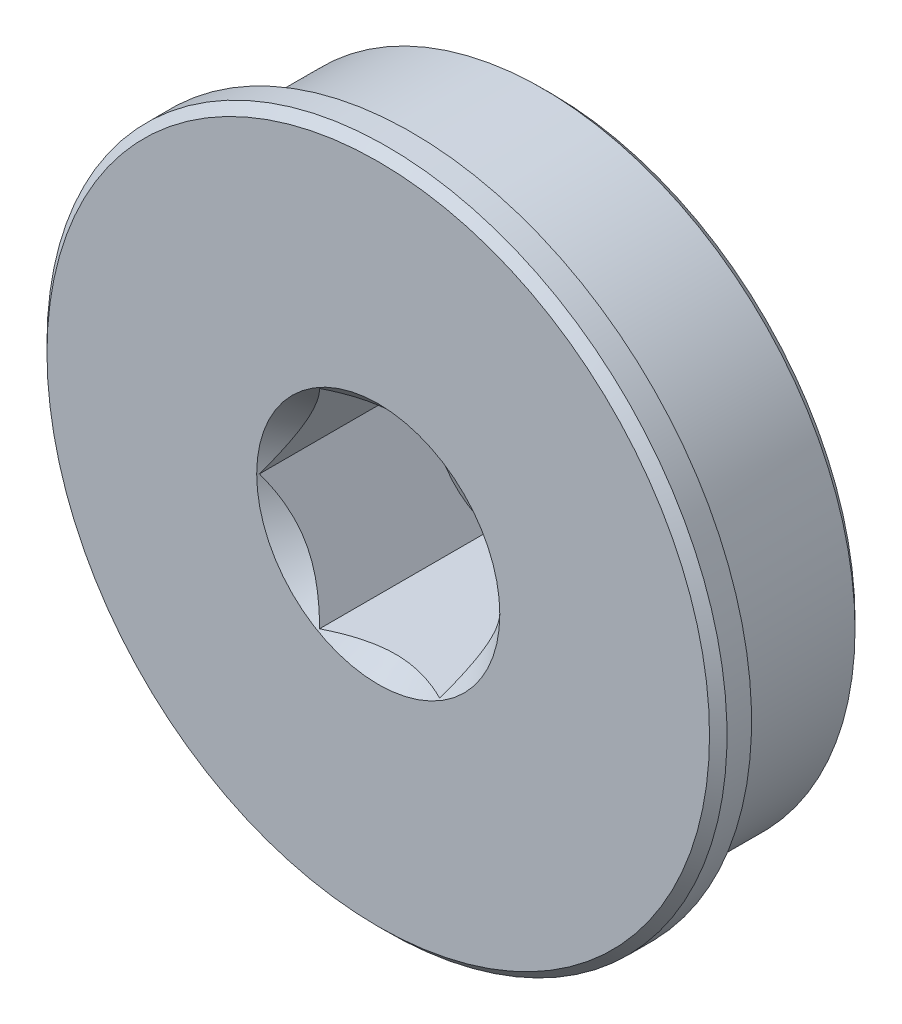
ISO-10303-21;
HEADER;
FILE_DESCRIPTION(('STEP AP214'),'2;1');
FILE_NAME('part.step','',(''),(''),'','','');
FILE_SCHEMA(('AUTOMOTIVE_DESIGN { 1 0 10303 214 1 1 1 1 }'));
ENDSEC;
DATA;
#1=APPLICATION_CONTEXT('core data for automotive mechanical design processes');
#2=APPLICATION_PROTOCOL_DEFINITION('international standard','automotive_design',2000,#1);
#3=PRODUCT_CONTEXT('',#1,'mechanical');
#4=PRODUCT('Part','Part','',(#3));
#5=PRODUCT_RELATED_PRODUCT_CATEGORY('part','',(#4));
#6=PRODUCT_DEFINITION_FORMATION('','',#4);
#7=PRODUCT_DEFINITION_CONTEXT('part definition',#1,'design');
#8=PRODUCT_DEFINITION('design','',#6,#7);
#9=PRODUCT_DEFINITION_SHAPE('','',#8);
#10=(LENGTH_UNIT() NAMED_UNIT(*) SI_UNIT(.MILLI.,.METRE.));
#11=(NAMED_UNIT(*) PLANE_ANGLE_UNIT() SI_UNIT($,.RADIAN.));
#12=(NAMED_UNIT(*) SI_UNIT($,.STERADIAN.) SOLID_ANGLE_UNIT());
#13=UNCERTAINTY_MEASURE_WITH_UNIT(LENGTH_MEASURE(1.E-05),#10,'distance_accuracy_value','');
#14=(GEOMETRIC_REPRESENTATION_CONTEXT(3) GLOBAL_UNCERTAINTY_ASSIGNED_CONTEXT((#13)) GLOBAL_UNIT_ASSIGNED_CONTEXT((#10,
#11,#12)) REPRESENTATION_CONTEXT('',''));
#15=CARTESIAN_POINT('',(0.,0.,0.));
#16=DIRECTION('',(0.,0.,1.));
#17=DIRECTION('',(1.,0.,0.));
#18=AXIS2_PLACEMENT_3D('',#15,#16,#17);
#19=CARTESIAN_POINT('',(0.,0.,7.92734));
#20=DIRECTION('',(0.,0.,-1.));
#21=DIRECTION('',(-1.,0.,0.));
#22=AXIS2_PLACEMENT_3D('',#19,#20,#21);
#23=CYLINDRICAL_SURFACE('',#22,14.2875);
#24=CARTESIAN_POINT('',(0.,0.,5.89534));
#25=DIRECTION('',(0.,0.,-1.));
#26=DIRECTION('',(-1.,0.,0.));
#27=AXIS2_PLACEMENT_3D('',#24,#25,#26);
#28=CIRCLE('',#27,14.2875);
#29=CARTESIAN_POINT('',(-14.2875,0.,5.89534));
#30=VERTEX_POINT('',#29);
#31=EDGE_CURVE('E19',#30,#30,#28,.F.);
#32=ORIENTED_EDGE('',*,*,#31,.F.);
#33=EDGE_LOOP('',(#32));
#34=FACE_BOUND('',#33,.T.);
#35=CARTESIAN_POINT('',(0.,0.,0.399999999999991));
#36=DIRECTION('',(0.,0.,1.));
#37=DIRECTION('',(1.,0.,0.));
#38=AXIS2_PLACEMENT_3D('',#35,#36,#37);
#39=CIRCLE('',#38,14.2875);
#40=CARTESIAN_POINT('',(14.2875,0.,0.39999999999999));
#41=VERTEX_POINT('',#40);
#42=EDGE_CURVE('E111',#41,#41,#39,.F.);
#43=ORIENTED_EDGE('',*,*,#42,.F.);
#44=EDGE_LOOP('',(#43));
#45=FACE_BOUND('',#44,.T.);
#46=ADVANCED_FACE('F16',(#34,#45),#23,.T.);
#47=CARTESIAN_POINT('',(0.,0.,0.399999999999991));
#48=DIRECTION('',(0.,0.,1.));
#49=DIRECTION('',(1.,0.,0.));
#50=AXIS2_PLACEMENT_3D('',#47,#48,#49);
#51=CONICAL_SURFACE('',#50,14.2875,0.785398163397453);
#52=ORIENTED_EDGE('',*,*,#42,.T.);
#53=EDGE_LOOP('',(#52));
#54=FACE_BOUND('',#53,.T.);
#55=CARTESIAN_POINT('',(0.,0.,0.));
#56=DIRECTION('',(0.,0.,1.));
#57=DIRECTION('',(1.,0.,0.));
#58=AXIS2_PLACEMENT_3D('',#55,#56,#57);
#59=CIRCLE('',#58,13.8875);
#60=CARTESIAN_POINT('',(13.8875,0.,0.));
#61=VERTEX_POINT('',#60);
#62=EDGE_CURVE('E107',#61,#61,#59,.F.);
#63=ORIENTED_EDGE('',*,*,#62,.F.);
#64=EDGE_LOOP('',(#63));
#65=FACE_BOUND('',#64,.T.);
#66=ADVANCED_FACE('F324',(#54,#65),#51,.T.);
#67=CARTESIAN_POINT('',(14.2875,0.,5.89534));
#68=DIRECTION('',(0.,0.,1.));
#69=DIRECTION('',(1.,0.,0.));
#70=AXIS2_PLACEMENT_3D('',#67,#68,#69);
#71=PLANE('',#70);
#72=ORIENTED_EDGE('',*,*,#31,.T.);
#73=EDGE_LOOP('',(#72));
#74=FACE_BOUND('',#73,.T.);
#75=CARTESIAN_POINT('',(0.,0.,5.89534));
#76=DIRECTION('',(0.,0.,-1.));
#77=DIRECTION('',(-1.,0.,0.));
#78=AXIS2_PLACEMENT_3D('',#75,#76,#77);
#79=CIRCLE('',#78,13.97);
#80=CARTESIAN_POINT('',(-13.97,0.,5.89534));
#81=VERTEX_POINT('',#80);
#82=EDGE_CURVE('E86',#81,#81,#79,.F.);
#83=ORIENTED_EDGE('',*,*,#82,.F.);
#84=EDGE_LOOP('',(#83));
#85=FACE_BOUND('',#84,.T.);
#86=ADVANCED_FACE('F322',(#74,#85),#71,.T.);
#87=CARTESIAN_POINT('',(0.,0.,0.));
#88=DIRECTION('',(0.,0.,-1.));
#89=DIRECTION('',(-1.,0.,0.));
#90=AXIS2_PLACEMENT_3D('',#87,#88,#89);
#91=PLANE('',#90);
#92=CARTESIAN_POINT('',(0.,0.,0.));
#93=DIRECTION('',(0.,0.,-1.));
#94=DIRECTION('',(-1.,0.,0.));
#95=AXIS2_PLACEMENT_3D('',#92,#93,#94);
#96=CIRCLE('',#95,5.56250000005321);
#97=CARTESIAN_POINT('',(-5.56250000005321,0.,0.));
#98=VERTEX_POINT('',#97);
#99=CARTESIAN_POINT('',(5.56250000005321,0.,0.));
#100=VERTEX_POINT('',#99);
#101=EDGE_CURVE('E80',#98,#100,#96,.F.);
#102=ORIENTED_EDGE('',*,*,#101,.T.);
#103=CARTESIAN_POINT('',(0.,0.,0.));
#104=DIRECTION('',(0.,0.,-1.));
#105=DIRECTION('',(-1.,0.,0.));
#106=AXIS2_PLACEMENT_3D('',#103,#104,#105);
#107=CIRCLE('',#106,5.56250000005321);
#108=EDGE_CURVE('E78',#100,#98,#107,.F.);
#109=ORIENTED_EDGE('',*,*,#108,.T.);
#110=EDGE_LOOP('',(#102,#109));
#111=FACE_BOUND('',#110,.T.);
#112=ORIENTED_EDGE('',*,*,#62,.T.);
#113=EDGE_LOOP('',(#112));
#114=FACE_BOUND('',#113,.T.);
#115=ADVANCED_FACE('F82',(#111,#114),#91,.T.);
#116=CARTESIAN_POINT('',(0.,0.,7.92734));
#117=DIRECTION('',(0.,0.,-1.));
#118=DIRECTION('',(-1.,0.,0.));
#119=AXIS2_PLACEMENT_3D('',#116,#117,#118);
#120=CYLINDRICAL_SURFACE('',#119,13.97);
#121=CARTESIAN_POINT('',(0.,0.,6.40333999999999));
#122=DIRECTION('',(0.,0.,-1.));
#123=DIRECTION('',(-1.,0.,0.));
#124=AXIS2_PLACEMENT_3D('',#121,#122,#123);
#125=CIRCLE('',#124,13.97);
#126=CARTESIAN_POINT('',(-13.97,0.,6.40333999999999));
#127=VERTEX_POINT('',#126);
#128=EDGE_CURVE('E96',#127,#127,#125,.F.);
#129=ORIENTED_EDGE('',*,*,#128,.F.);
#130=EDGE_LOOP('',(#129));
#131=FACE_BOUND('',#130,.T.);
#132=ORIENTED_EDGE('',*,*,#82,.T.);
#133=EDGE_LOOP('',(#132));
#134=FACE_BOUND('',#133,.T.);
#135=ADVANCED_FACE('F317',(#131,#134),#120,.T.);
#136=CARTESIAN_POINT('',(0.,0.,5.6843418860808E-11));
#137=DIRECTION('',(0.,0.,-1.));
#138=DIRECTION('',(-1.,0.,0.));
#139=AXIS2_PLACEMENT_3D('',#136,#137,#138);
#140=CONICAL_SURFACE('',#139,5.56249999999636,0.78539816343273);
#141=DIRECTION('',(-0.707106781186546,0.,0.707106781186549));
#142=VECTOR('',#141,1.);
#143=CARTESIAN_POINT('',(499000.,2.82710390992634E-10,-498994.437500002));
#144=LINE('',#143,#142);
#145=CARTESIAN_POINT('',(5.49926131404698,0.,0.0632386859987952));
#146=VERTEX_POINT('',#145);
#147=EDGE_CURVE('E89',#146,#100,#144,.F.);
#148=ORIENTED_EDGE('',*,*,#147,.T.);
#149=ORIENTED_EDGE('',*,*,#101,.F.);
#150=DIRECTION('',(0.707106781186546,0.,0.707106781186549));
#151=VECTOR('',#150,1.);
#152=CARTESIAN_POINT('',(-499000.,0.,-498994.437500002));
#153=LINE('',#152,#151);
#154=CARTESIAN_POINT('',(-5.49926131403277,0.,0.0632386860104361));
#155=VERTEX_POINT('',#154);
#156=EDGE_CURVE('E97',#98,#155,#153,.T.);
#157=ORIENTED_EDGE('',*,*,#156,.T.);
#158=CARTESIAN_POINT('',(-5.49926131403804,1.18659976195965E-11,0.0632386860107016));
#159=CARTESIAN_POINT('',(-5.45198595772965,-0.0818833190601881,0.110506947567132));
#160=CARTESIAN_POINT('',(-5.4043472336898,-0.164396009504968,0.156324527278759));
#161=CARTESIAN_POINT('',(-5.30827177630542,-0.330803583055125,0.244617067987538));
#162=CARTESIAN_POINT('',(-5.25983462438558,-0.414699191154228,0.287090203603892));
#163=CARTESIAN_POINT('',(-5.11276872494,-0.669424801054789,0.409193172400382));
#164=CARTESIAN_POINT('',(-5.01289507458583,-0.842411037805577,0.482985773947434));
#165=CARTESIAN_POINT('',(-4.81149193757784,-1.19125150390717,0.609350104502553));
#166=CARTESIAN_POINT('',(-4.7100139148593,-1.36701659510731,0.662240148531795));
#167=CARTESIAN_POINT('',(-4.55612875084035,-1.63355351771921,0.72342062198653));
#168=CARTESIAN_POINT('',(-4.50460715798088,-1.72279153423868,0.740780167979902));
#169=CARTESIAN_POINT('',(-4.4011277941172,-1.90202304998548,0.769054944958566));
#170=CARTESIAN_POINT('',(-4.34917008945733,-1.99201643430103,0.779971138755429));
#171=CARTESIAN_POINT('',(-4.22255179984706,-2.21132574507349,0.798274186055481));
#172=CARTESIAN_POINT('',(-4.14775478082757,-2.34087798226995,0.802113970657308));
#173=CARTESIAN_POINT('',(-3.99829560170455,-2.59974887416856,0.795665524085403));
#174=CARTESIAN_POINT('',(-3.92363349805333,-2.72906743109243,0.785372340915283));
#175=CARTESIAN_POINT('',(-3.77501324604949,-2.98648525859677,0.751264702681386));
#176=CARTESIAN_POINT('',(-3.7010559789129,-3.1145830028663,0.727435130186419));
#177=CARTESIAN_POINT('',(-3.55441260790367,-3.36857677204746,0.66755022012039));
#178=CARTESIAN_POINT('',(-3.48172640699253,-3.49447296503472,0.63149582016656));
#179=CARTESIAN_POINT('',(-3.35270421975944,-3.71794594862609,0.557326230398962));
#180=CARTESIAN_POINT('',(-3.29608236647693,-3.81601787533011,0.521162786586692));
#181=CARTESIAN_POINT('',(-3.1838549314029,-4.01040149488146,0.443009120114986));
#182=CARTESIAN_POINT('',(-3.1282493803085,-4.10671313455982,0.40101872178217));
#183=CARTESIAN_POINT('',(-3.01822970362518,-4.29727280440763,0.312152198960926));
#184=CARTESIAN_POINT('',(-2.96381244920262,-4.39152625387591,0.26529144057966));
#185=CARTESIAN_POINT('',(-2.85598543231198,-4.57828812555909,0.16729922706902));
#186=CARTESIAN_POINT('',(-2.80257507665836,-4.67079757520149,0.116170389278389));
#187=CARTESIAN_POINT('',(-2.7496306570061,-4.76250000001645,0.063238686008056));
#188=B_SPLINE_CURVE_WITH_KNOTS('',3,(#158,#159,#160,#161,#162,#163,#164,#165,#166,#167,#168,
#169,#170,#171,#172,#173,#174,#175,#176,#177,#178,#179,#180,#181,#182,#183,#184,#185,#186,#187),
.UNSPECIFIED.,.F.,.F.,(4,2,2,2,2,2,2,2,2,2,2,2,2,2,4),(0.,0.317104656893012,0.634381205252719,
1.27235901342845,1.90020789118233,2.21351671576848,2.52677871165913,2.97501111031568,
3.42340060348885,3.87229184505846,4.32114866544751,4.67761480851316,5.03409170080002,
5.38947620702358,5.74464435760608),.UNSPECIFIED.);
#189=CARTESIAN_POINT('',(-2.74963065702047,-4.76250000000844,0.063238686007807));
#190=VERTEX_POINT('',#189);
#191=EDGE_CURVE('E198',#155,#190,#188,.T.);
#192=ORIENTED_EDGE('',*,*,#191,.T.);
#193=CARTESIAN_POINT('',(-2.74963065703375,-4.76249999999388,0.0632386860051244));
#194=CARTESIAN_POINT('',(-2.6550799444177,-4.76249999999775,0.110506947563377));
#195=CARTESIAN_POINT('',(-2.55980249633826,-4.76249999999939,0.156324527275844));
#196=CARTESIAN_POINT('',(-2.36765158156962,-4.76250000000062,0.244617067985395));
#197=CARTESIAN_POINT('',(-2.27077727772978,-4.76250000000022,0.287090203601681));
#198=CARTESIAN_POINT('',(-1.9766454788383,-4.76249999999957,0.409193172398205));
#199=CARTESIAN_POINT('',(-1.77689817812992,-4.76249999999989,0.482985773945614));
#200=CARTESIAN_POINT('',(-1.37409190411378,-4.76250000000011,0.609350104501253));
#201=CARTESIAN_POINT('',(-1.17113585867659,-4.76250000000002,0.662240148530666));
#202=CARTESIAN_POINT('',(-0.863365530638528,-4.76249999999999,0.723420621985702));
#203=CARTESIAN_POINT('',(-0.760322344919535,-4.7625,0.740780167979182));
#204=CARTESIAN_POINT('',(-0.553363617192058,-4.76250000000001,0.769054944958056));
#205=CARTESIAN_POINT('',(-0.449448207872247,-4.7625,0.77997113875502));
#206=CARTESIAN_POINT('',(-0.196211628651707,-4.7625,0.798274186055298));
#207=CARTESIAN_POINT('',(-0.0466175906127926,-4.7625,0.802113970657263));
#208=CARTESIAN_POINT('',(0.252300767633113,-4.7625,0.795665524085643));
#209=CARTESIAN_POINT('',(0.401624974935481,-4.7625,0.785372340915671));
#210=CARTESIAN_POINT('',(0.69886547894306,-4.7625,0.751264702682073));
#211=CARTESIAN_POINT('',(0.846780013216213,-4.7625,0.727435130187255));
#212=CARTESIAN_POINT('',(1.14006675523461,-4.7625,0.667550220121516));
#213=CARTESIAN_POINT('',(1.28543915705687,-4.7625,0.631495820167828));
#214=CARTESIAN_POINT('',(1.54348353152346,-4.7625,0.557326230400343));
#215=CARTESIAN_POINT('',(1.65672723808892,-4.7625,0.521162786588019));
#216=CARTESIAN_POINT('',(1.88118210823782,-4.7625,0.443009120116156));
#217=CARTESIAN_POINT('',(1.99239321042703,-4.7625,0.401018721783236));
#218=CARTESIAN_POINT('',(2.21243256379448,-4.7625,0.312152198961746));
#219=CARTESIAN_POINT('',(2.32126707264,-4.7625,0.265291440580338));
#220=CARTESIAN_POINT('',(2.53692110642206,-4.7625,0.167299227069382));
#221=CARTESIAN_POINT('',(2.64374181772969,-4.7625,0.116170389278577));
#222=CARTESIAN_POINT('',(2.74963065703459,-4.7625,0.0632386860080572));
#223=B_SPLINE_CURVE_WITH_KNOTS('',3,(#193,#194,#195,#196,#197,#198,#199,#200,#201,#202,#203,
#204,#205,#206,#207,#208,#209,#210,#211,#212,#213,#214,#215,#216,#217,#218,#219,#220,#221,#222),
.UNSPECIFIED.,.F.,.F.,(4,2,2,2,2,2,2,2,2,2,2,2,2,2,4),(0.,0.317104656893387,0.634381205253417,
1.27235901342969,1.90020789118398,2.21351671577036,2.52677871166125,2.9750111103176,
3.42340060349056,3.87229184505998,4.32114866544885,4.67761480851579,5.03409170080393,
5.38947620702875,5.7446443576125),.UNSPECIFIED.);
#224=CARTESIAN_POINT('',(2.74963065702534,-4.7625,0.0632386860126813));
#225=VERTEX_POINT('',#224);
#226=EDGE_CURVE('E241',#190,#225,#223,.T.);
#227=ORIENTED_EDGE('',*,*,#226,.T.);
#228=CARTESIAN_POINT('',(2.74963065700122,-4.76250000001267,0.0632386860051247));
#229=CARTESIAN_POINT('',(2.79690601331258,-4.68061668094318,0.110506947563377));
#230=CARTESIAN_POINT('',(2.84454473735372,-4.59810399049945,0.156324527275843));
#231=CARTESIAN_POINT('',(2.94062019473911,-4.43169641695001,0.244617067985391));
#232=CARTESIAN_POINT('',(2.98905734665868,-4.34780080885058,0.287090203601677));
#233=CARTESIAN_POINT('',(3.13612324610386,-4.09307519894942,0.409193172398199));
#234=CARTESIAN_POINT('',(3.23599689645832,-3.92008896219876,0.482985773945608));
#235=CARTESIAN_POINT('',(3.43740003346658,-3.57124849609714,0.609350104501249));
#236=CARTESIAN_POINT('',(3.5388780561851,-3.39548340489686,0.662240148530663));
#237=CARTESIAN_POINT('',(3.69276322020411,-3.1289464822848,0.723420621985703));
#238=CARTESIAN_POINT('',(3.74428481306361,-3.03970846576528,0.740780167979184));
#239=CARTESIAN_POINT('',(3.84776417692736,-2.86047695001837,0.769054944958059));
#240=CARTESIAN_POINT('',(3.89972188158727,-2.77048356570276,0.779971138755023));
#241=CARTESIAN_POINT('',(4.02634017119754,-2.55117425493029,0.798274186055301));
#242=CARTESIAN_POINT('',(4.10113719021699,-2.4216220177339,0.802113970657266));
#243=CARTESIAN_POINT('',(4.25059636933995,-2.1627511258354,0.795665524085647));
#244=CARTESIAN_POINT('',(4.32525847299113,-2.03343256891158,0.785372340915674));
#245=CARTESIAN_POINT('',(4.47387872499492,-1.77601474140732,0.751264702682075));
#246=CARTESIAN_POINT('',(4.5478359921315,-1.64791699713783,0.727435130187257));
#247=CARTESIAN_POINT('',(4.6944793631407,-1.39392322795673,0.667550220121518));
#248=CARTESIAN_POINT('',(4.76716556405182,-1.26802703496949,0.631495820167831));
#249=CARTESIAN_POINT('',(4.89618775128488,-1.04455405137818,0.557326230400483));
#250=CARTESIAN_POINT('',(4.95280960456738,-0.946482124674183,0.521162786588324));
#251=CARTESIAN_POINT('',(5.06503703964137,-0.752098505122895,0.443009120116835));
#252=CARTESIAN_POINT('',(5.12064259073575,-0.655786865444557,0.401018721784125));
#253=CARTESIAN_POINT('',(5.23066226741904,-0.465227195596805,0.312152198963087));
#254=CARTESIAN_POINT('',(5.28507952184158,-0.370973746128555,0.265291440581923));
#255=CARTESIAN_POINT('',(5.39290653873218,-0.184211874445441,0.167299227071481));
#256=CARTESIAN_POINT('',(5.44631689438579,-0.091702424803064,0.116170389280945));
#257=CARTESIAN_POINT('',(5.49926131403804,1.18695657091106E-11,0.0632386860107053));
#258=B_SPLINE_CURVE_WITH_KNOTS('',3,(#228,#229,#230,#231,#232,#233,#234,#235,#236,#237,#238,
#239,#240,#241,#242,#243,#244,#245,#246,#247,#248,#249,#250,#251,#252,#253,#254,#255,#256,#257),
.UNSPECIFIED.,.F.,.F.,(4,2,2,2,2,2,2,2,2,2,2,2,2,2,4),(0.,0.31710465689338,0.634381205253403,
1.27235901342967,1.90020789118397,2.21351671577036,2.52677871166125,2.97501111031761,
3.42340060349057,3.87229184505999,4.32114866544885,4.67761480851431,5.03409170080096,
5.38947620702431,5.74464435760659),.UNSPECIFIED.);
#259=EDGE_CURVE('E92',#225,#146,#258,.T.);
#260=ORIENTED_EDGE('',*,*,#259,.T.);
#261=EDGE_LOOP('',(#148,#149,#157,#192,#227,#260));
#262=FACE_BOUND('',#261,.T.);
#263=ADVANCED_FACE('F90',(#262),#140,.F.);
#264=CARTESIAN_POINT('',(0.,0.,5.6843418860808E-11));
#265=DIRECTION('',(0.,0.,-1.));
#266=DIRECTION('',(-1.,0.,0.));
#267=AXIS2_PLACEMENT_3D('',#264,#265,#266);
#268=CONICAL_SURFACE('',#267,5.56249999999636,0.785398163397448);
#269=CARTESIAN_POINT('',(5.49926131403893,-1.34103842338314E-11,0.0632386860142758));
#270=CARTESIAN_POINT('',(5.4519859577334,0.0818833190536932,0.110506947571208));
#271=CARTESIAN_POINT('',(5.4043472336964,0.164396009493517,0.156324527283451));
#272=CARTESIAN_POINT('',(5.30827177631776,0.330803583033754,0.244617067993731));
#273=CARTESIAN_POINT('',(5.25983462440078,0.414699191127893,0.287090203610971));
#274=CARTESIAN_POINT('',(5.1127687249638,0.669424801013557,0.409193172410618));
#275=CARTESIAN_POINT('',(5.01289507461536,0.842411037754417,0.482985773960409));
#276=CARTESIAN_POINT('',(4.81149193761852,1.1912515038367,0.609350104522551));
#277=CARTESIAN_POINT('',(4.7100139149054,1.36701659502745,0.662240148556033));
#278=CARTESIAN_POINT('',(4.55612875089437,1.63355351762563,0.723420622018186));
#279=CARTESIAN_POINT('',(4.5046071580375,1.7227915341406,0.740780168014203));
#280=CARTESIAN_POINT('',(4.40112779417895,1.90202304987853,0.769054944998465));
#281=CARTESIAN_POINT('',(4.34917008952159,1.99201643418973,0.77997113879828));
#282=CARTESIAN_POINT('',(4.22255179992084,2.2113257449457,0.798274186105289));
#283=CARTESIAN_POINT('',(4.14775478090832,2.34087798213007,0.802113970711906));
#284=CARTESIAN_POINT('',(3.998295601799,2.59974887400496,0.795665524151122));
#285=CARTESIAN_POINT('',(3.9236334981545,2.72906743091721,0.785372340987336));
#286=CARTESIAN_POINT('',(3.77501324616378,2.98648525839881,0.751264702767226));
#287=CARTESIAN_POINT('',(3.7010559790336,3.11458300265724,0.727435130279712));
#288=CARTESIAN_POINT('',(3.55441260803689,3.3685767718167,0.667550220229242));
#289=CARTESIAN_POINT('',(3.48172640713187,3.49447296479336,0.631495820283519));
#290=CARTESIAN_POINT('',(3.35270421989156,3.71794594839724,0.557326230520373));
#291=CARTESIAN_POINT('',(3.29608236659605,3.81601787512378,0.521162786702295));
#292=CARTESIAN_POINT('',(3.18385493149657,4.01040149471922,0.443009120215609));
#293=CARTESIAN_POINT('',(3.12824938038971,4.10671313441917,0.401018721873618));
#294=CARTESIAN_POINT('',(3.01822970368199,4.29727280430924,0.312152199031279));
#295=CARTESIAN_POINT('',(2.96381244924748,4.3915262537982,0.265291440638092));
#296=CARTESIAN_POINT('',(2.85598543233356,4.57828812552171,0.167299227101493));
#297=CARTESIAN_POINT('',(2.80257507666858,4.67079757518378,0.116170389296827));
#298=CARTESIAN_POINT('',(2.74963065700522,4.76250000001796,0.0632386860116488));
#299=B_SPLINE_CURVE_WITH_KNOTS('',3,(#269,#270,#271,#272,#273,#274,#275,#276,#277,#278,#279,
#280,#281,#282,#283,#284,#285,#286,#287,#288,#289,#290,#291,#292,#293,#294,#295,#296,#297,#298),
.UNSPECIFIED.,.F.,.F.,(4,2,2,2,2,2,2,2,2,2,2,2,2,2,4),(0.,0.317104656878347,0.634381205223374,
1.27235901336977,1.90020789109549,2.21351671566756,2.52677871154414,2.97501111015932,
3.42340060329106,3.87229184481917,4.32114866516673,4.6776148083118,5.0340917006782,
5.38947620698162,5.74464435764363),.UNSPECIFIED.);
#300=CARTESIAN_POINT('',(2.74963065701027,4.76250000000922,0.0632386860166967));
#301=VERTEX_POINT('',#300);
#302=EDGE_CURVE('E182',#146,#301,#299,.T.);
#303=ORIENTED_EDGE('',*,*,#302,.T.);
#304=CARTESIAN_POINT('',(2.74963065703541,4.76249999999333,0.0632386860084486));
#305=CARTESIAN_POINT('',(2.65507994442516,4.76249999999754,0.110506947567354));
#306=CARTESIAN_POINT('',(2.55980249635148,4.76249999999933,0.1563245272805));
#307=CARTESIAN_POINT('',(2.36765158159434,4.76250000000068,0.244617067991594));
#308=CARTESIAN_POINT('',(2.27077727776023,4.76250000000024,0.287090203608747));
#309=CARTESIAN_POINT('',(1.97664547888597,4.76249999999953,0.40919317240839));
#310=CARTESIAN_POINT('',(1.77689817818909,4.76249999999988,0.482985773958544));
#311=CARTESIAN_POINT('',(1.37409190419531,4.76250000000013,0.609350104521207));
#312=CARTESIAN_POINT('',(1.17113585876899,4.76250000000003,0.662240148554853));
#313=CARTESIAN_POINT('',(0.863365530746804,4.76249999999999,0.723420622017311));
#314=CARTESIAN_POINT('',(0.760322345033031,4.7625,0.74078016801344));
#315=CARTESIAN_POINT('',(0.553363617315818,4.76250000000001,0.769054944997919));
#316=CARTESIAN_POINT('',(0.449448208001051,4.76250000000001,0.779971138797839));
#317=CARTESIAN_POINT('',(0.196211628799575,4.7625,0.798274186105088));
#318=CARTESIAN_POINT('',(0.0466175907746237,4.76250000000001,0.802113970711852));
#319=CARTESIAN_POINT('',(-0.252300767443882,4.76250000000001,0.795665524151375));
#320=CARTESIAN_POINT('',(-0.401624974732814,4.76250000000001,0.785372340987749));
#321=CARTESIAN_POINT('',(-0.698865478714131,4.76250000000001,0.751264702767959));
#322=CARTESIAN_POINT('',(-0.84678001297446,4.76250000000001,0.727435130280605));
#323=CARTESIAN_POINT('',(-1.14006675496779,4.76250000000001,0.667550220230448));
#324=CARTESIAN_POINT('',(-1.2854391567778,4.76250000000001,0.631495820284878));
#325=CARTESIAN_POINT('',(-1.54348353125888,4.76250000000001,0.557326230521854));
#326=CARTESIAN_POINT('',(-1.65672723785036,4.76250000000001,0.521162786703718));
#327=CARTESIAN_POINT('',(-1.88118210805024,4.76250000000001,0.443009120216864));
#328=CARTESIAN_POINT('',(-1.99239321026441,4.76250000000001,0.401018721874762));
#329=CARTESIAN_POINT('',(-2.21243256368073,4.76250000000001,0.312152199032158));
#330=CARTESIAN_POINT('',(-2.32126707255016,4.76250000000001,0.265291440638818));
#331=CARTESIAN_POINT('',(-2.53692110637885,4.76250000000001,0.167299227101879));
#332=CARTESIAN_POINT('',(-2.64374181770921,4.76250000000001,0.116170389297026));
#333=CARTESIAN_POINT('',(-2.74963065703633,4.76250000000001,0.0632386860116463));
#334=B_SPLINE_CURVE_WITH_KNOTS('',3,(#304,#305,#306,#307,#308,#309,#310,#311,#312,#313,#314,
#315,#316,#317,#318,#319,#320,#321,#322,#323,#324,#325,#326,#327,#328,#329,#330,#331,#332,#333),
.UNSPECIFIED.,.F.,.F.,(4,2,2,2,2,2,2,2,2,2,2,2,2,2,4),(0.,0.317104656878694,0.634381205224013,
1.27235901337088,1.90020789109692,2.21351671566918,2.52677871154595,2.97501111016091,
3.42340060329241,3.87229184482032,4.32114866516769,4.67761480831413,5.03409170068191,
5.38947620698669,5.74464435765004),.UNSPECIFIED.);
#335=CARTESIAN_POINT('',(-2.74963065702623,4.76250000000001,0.0632386860166947));
#336=VERTEX_POINT('',#335);
#337=EDGE_CURVE('E192',#301,#336,#334,.T.);
#338=ORIENTED_EDGE('',*,*,#337,.T.);
#339=CARTESIAN_POINT('',(-2.7496306569999,4.76250000001383,0.063238686008446));
#340=CARTESIAN_POINT('',(-2.79690601330868,4.68061668094954,0.110506947567351));
#341=CARTESIAN_POINT('',(-2.84454473734706,4.59810399051088,0.156324527280496));
#342=CARTESIAN_POINT('',(-2.9406201947268,4.43169641697145,0.244617067991589));
#343=CARTESIAN_POINT('',(-2.98905734664347,4.34780080887696,0.28709020360874));
#344=CARTESIAN_POINT('',(-3.13612324607998,4.0930751989907,0.409193172408382));
#345=CARTESIAN_POINT('',(-3.23599689642873,3.92008896225,0.482985773958535));
#346=CARTESIAN_POINT('',(-3.43740003342583,3.57124849616776,0.609350104521201));
#347=CARTESIAN_POINT('',(-3.5388780561389,3.39548340497688,0.66224014855485));
#348=CARTESIAN_POINT('',(-3.69276322014997,3.12894648237858,0.723420622017311));
#349=CARTESIAN_POINT('',(-3.74428481300687,3.03970846586357,0.74078016801344));
#350=CARTESIAN_POINT('',(-3.84776417686548,2.86047695012556,0.76905494499792));
#351=CARTESIAN_POINT('',(-3.89972188152286,2.77048356581431,0.77997113879784));
#352=CARTESIAN_POINT('',(-4.0263401711236,2.55117425505836,0.798274186105089));
#353=CARTESIAN_POINT('',(-4.10113719013608,2.42162201787405,0.802113970711854));
#354=CARTESIAN_POINT('',(-4.25059636924534,2.16275112599929,0.795665524151377));
#355=CARTESIAN_POINT('',(-4.3252584728898,2.0334325690871,0.78537234098775));
#356=CARTESIAN_POINT('',(-4.47387872488046,1.77601474160559,0.75126470276796));
#357=CARTESIAN_POINT('',(-4.54783599201062,1.6479169973472,0.727435130280605));
#358=CARTESIAN_POINT('',(-4.69447936300729,1.39392322818781,0.667550220230449));
#359=CARTESIAN_POINT('',(-4.76716556391229,1.26802703521118,0.63149582028488));
#360=CARTESIAN_POINT('',(-4.89618775115259,1.04455405160731,0.557326230521992));
#361=CARTESIAN_POINT('',(-4.95280960444811,0.946482124880775,0.52116278670402));
#362=CARTESIAN_POINT('',(-5.06503703954759,0.752098505285329,0.443009120217536));
#363=CARTESIAN_POINT('',(-5.12064259065445,0.655786865585378,0.401018721875641));
#364=CARTESIAN_POINT('',(-5.23066226736217,0.465227195695301,0.312152199033486));
#365=CARTESIAN_POINT('',(-5.28507952179667,0.370973746206341,0.265291440640388));
#366=CARTESIAN_POINT('',(-5.3929065387106,0.184211874482832,0.167299227103959));
#367=CARTESIAN_POINT('',(-5.44631689437558,0.0917024248207689,0.116170389299374));
#368=CARTESIAN_POINT('',(-5.49926131403893,-1.34137727442273E-11,0.0632386860142718));
#369=B_SPLINE_CURVE_WITH_KNOTS('',3,(#339,#340,#341,#342,#343,#344,#345,#346,#347,#348,#349,
#350,#351,#352,#353,#354,#355,#356,#357,#358,#359,#360,#361,#362,#363,#364,#365,#366,#367,#368),
.UNSPECIFIED.,.F.,.F.,(4,2,2,2,2,2,2,2,2,2,2,2,2,2,4),(0.,0.317104656878688,0.634381205224,
1.27235901337085,1.90020789109691,2.21351671566918,2.52677871154596,2.97501111016092,
3.42340060329243,3.87229184482033,4.32114866516769,4.67761480831267,5.03409170067897,
5.38947620698229,5.74464435764419),.UNSPECIFIED.);
#370=EDGE_CURVE('E214',#336,#155,#369,.T.);
#371=ORIENTED_EDGE('',*,*,#370,.T.);
#372=ORIENTED_EDGE('',*,*,#156,.F.);
#373=ORIENTED_EDGE('',*,*,#108,.F.);
#374=ORIENTED_EDGE('',*,*,#147,.F.);
#375=EDGE_LOOP('',(#303,#338,#371,#372,#373,#374));
#376=FACE_BOUND('',#375,.T.);
#377=ADVANCED_FACE('F99',(#376),#268,.F.);
#378=CARTESIAN_POINT('',(13.97,0.,6.40334));
#379=DIRECTION('',(0.,0.,-1.));
#380=DIRECTION('',(-1.,0.,0.));
#381=AXIS2_PLACEMENT_3D('',#378,#379,#380);
#382=PLANE('',#381);
#383=ORIENTED_EDGE('',*,*,#128,.T.);
#384=EDGE_LOOP('',(#383));
#385=FACE_BOUND('',#384,.T.);
#386=CARTESIAN_POINT('',(0.,0.,6.40334));
#387=DIRECTION('',(0.,0.,-1.));
#388=DIRECTION('',(-1.,0.,0.));
#389=AXIS2_PLACEMENT_3D('',#386,#387,#388);
#390=CIRCLE('',#389,15.5575);
#391=CARTESIAN_POINT('',(-15.5575,0.,6.40334));
#392=VERTEX_POINT('',#391);
#393=EDGE_CURVE('E220',#392,#392,#390,.F.);
#394=ORIENTED_EDGE('',*,*,#393,.F.);
#395=EDGE_LOOP('',(#394));
#396=FACE_BOUND('',#395,.T.);
#397=ADVANCED_FACE('F208',(#385,#396),#382,.T.);
#398=CARTESIAN_POINT('',(-2.7496306570156,-4.7625,-2.07266));
#399=DIRECTION('',(0.,-1.,0.));
#400=DIRECTION('',(1.,0.,0.));
#401=AXIS2_PLACEMENT_3D('',#398,#399,#400);
#402=PLANE('',#401);
#403=DIRECTION('',(0.,0.,1.));
#404=VECTOR('',#403,1.);
#405=CARTESIAN_POINT('',(-2.74963065701559,-4.7625,-2.07266));
#406=LINE('',#405,#404);
#407=CARTESIAN_POINT('',(-2.74963065347593,-4.76250000613089,7.86410131755513));
#408=VERTEX_POINT('',#407);
#409=EDGE_CURVE('E251',#190,#408,#406,.T.);
#410=ORIENTED_EDGE('',*,*,#409,.T.);
#411=CARTESIAN_POINT('',(-2.74963058630131,-4.7625,7.86410127865832));
#412=CARTESIAN_POINT('',(-2.65507987582223,-4.7625,7.81683301907868));
#413=CARTESIAN_POINT('',(-2.55980242990703,-4.7625,7.77101544131861));
#414=CARTESIAN_POINT('',(-2.36765151953662,-4.7625,7.6827229044405));
#415=CARTESIAN_POINT('',(-2.27077721793085,-4.7625,7.64024977070313));
#416=CARTESIAN_POINT('',(-1.97664542596643,-4.7625,7.51814680744944));
#417=CARTESIAN_POINT('',(-1.77689813007265,-4.7625,7.44435420940901));
#418=CARTESIAN_POINT('',(-1.37409186581547,-4.7625,7.31798988502014));
#419=CARTESIAN_POINT('',(-1.17113582531008,-4.7625,7.26509984368129));
#420=CARTESIAN_POINT('',(-0.863365504906673,-4.7625,7.20391937345893));
#421=CARTESIAN_POINT('',(-0.760322321760773,-4.7625,7.18655982840794));
#422=CARTESIAN_POINT('',(-0.553363599247437,-4.7625,7.15828505300743));
#423=CARTESIAN_POINT('',(-0.449448192568649,-4.7625,7.1473688598465));
#424=CARTESIAN_POINT('',(-0.196211616210636,-4.7625,7.12906581341892));
#425=CARTESIAN_POINT('',(-0.0466175783897936,-4.7625,7.12522602921167));
#426=CARTESIAN_POINT('',(0.252300779382325,-4.7625,7.13167447652517));
#427=CARTESIAN_POINT('',(0.401624986428969,-4.7625,7.14196766004211));
#428=CARTESIAN_POINT('',(0.698865489885795,-4.7625,7.17607529890175));
#429=CARTESIAN_POINT('',(0.846780023864053,-4.7625,7.19990487167419));
#430=CARTESIAN_POINT('',(1.14006676528345,-4.7625,7.25978978221977));
#431=CARTESIAN_POINT('',(1.28543916680162,-4.7625,7.29584418237563));
#432=CARTESIAN_POINT('',(1.54348353378876,-4.7625,7.37001377044799));
#433=CARTESIAN_POINT('',(1.65672723329773,-4.7625,7.40617721197187));
#434=CARTESIAN_POINT('',(1.88118208958368,-4.7625,7.48433087316742));
#435=CARTESIAN_POINT('',(1.9923931849666,-4.7625,7.52632126851205));
#436=CARTESIAN_POINT('',(2.21243252498062,-4.7625,7.61518778481037));
#437=CARTESIAN_POINT('',(2.32126702727848,-4.7625,7.66204853965798));
#438=CARTESIAN_POINT('',(2.53692104821533,-4.7625,7.7600407456796));
#439=CARTESIAN_POINT('',(2.64374175322498,-4.7625,7.81116957951583));
#440=CARTESIAN_POINT('',(2.74963058633439,-4.7625,7.86410127867486));
#441=B_SPLINE_CURVE_WITH_KNOTS('',3,(#411,#412,#413,#414,#415,#416,#417,#418,#419,#420,#421,
#422,#423,#424,#425,#426,#427,#428,#429,#430,#431,#432,#433,#434,#435,#436,#437,#438,#439,#440),
.UNSPECIFIED.,.F.,.F.,(4,2,2,2,2,2,2,2,2,2,2,2,2,2,4),(0.,0.317104648505196,0.634381188464759,
1.27235897947922,1.90020784095936,2.21351665747616,2.52677864530375,2.97501104327637,
3.42340053576013,3.87229177659448,4.32114859624607,4.67761471709309,5.03409158713586,
5.38947607114111,5.74464419957785),.UNSPECIFIED.);
#442=CARTESIAN_POINT('',(2.74963062167499,-4.7625,7.86410129634516));
#443=VERTEX_POINT('',#442);
#444=EDGE_CURVE('E224',#408,#443,#441,.T.);
#445=ORIENTED_EDGE('',*,*,#444,.T.);
#446=DIRECTION('',(0.,0.,1.));
#447=VECTOR('',#446,1.);
#448=CARTESIAN_POINT('',(2.74963065701559,-4.7625,-2.07266));
#449=LINE('',#448,#447);
#450=EDGE_CURVE('E246',#443,#225,#449,.F.);
#451=ORIENTED_EDGE('',*,*,#450,.T.);
#452=ORIENTED_EDGE('',*,*,#226,.F.);
#453=EDGE_LOOP('',(#410,#445,#451,#452));
#454=FACE_BOUND('',#453,.T.);
#455=ADVANCED_FACE('F234',(#454),#402,.F.);
#456=CARTESIAN_POINT('',(2.74963065701559,-4.7625,-2.07266));
#457=DIRECTION('',(0.866025403784439,-0.5,0.));
#458=DIRECTION('',(0.5,0.866025403784439,0.));
#459=AXIS2_PLACEMENT_3D('',#456,#457,#458);
#460=PLANE('',#459);
#461=ORIENTED_EDGE('',*,*,#450,.F.);
#462=CARTESIAN_POINT('',(2.74963064992551,-4.76250001228038,7.86410132110554));
#463=CARTESIAN_POINT('',(2.79690600644151,-4.68061669284875,7.81683305915564));
#464=CARTESIAN_POINT('',(2.8445447306916,-4.59810400203982,7.77101547905528));
#465=CARTESIAN_POINT('',(2.94062018850328,-4.43169642774955,7.68272293758276));
#466=CARTESIAN_POINT('',(2.9890573406402,-4.34780081927447,7.64024980159143));
#467=CARTESIAN_POINT('',(3.13612324075938,-4.09307520820719,7.5181468316874));
#468=CARTESIAN_POINT('',(3.2359968915821,-3.92008897064485,7.44435422943788));
#469=CARTESIAN_POINT('',(3.43740002955312,-3.57124850287524,7.31798989763433));
#470=CARTESIAN_POINT('',(3.53887805276528,-3.39548341082012,7.26509985305559));
#471=CARTESIAN_POINT('',(3.6927632175489,-3.12894648688378,7.20391937893835));
#472=CARTESIAN_POINT('',(3.74428481066616,-3.0397084699178,7.18655983275135));
#473=CARTESIAN_POINT('',(3.84776417505239,-2.86047695326592,7.15828505544727));
#474=CARTESIAN_POINT('',(3.89972187997702,-2.77048356849178,7.14736886151859));
#475=CARTESIAN_POINT('',(4.0263401698682,-2.55117425723278,7.12906581403464));
#476=CARTESIAN_POINT('',(4.10113718890353,-2.42162202000889,7.12522602934814));
#477=CARTESIAN_POINT('',(4.25059636806231,-2.16275112804833,7.13167447575927));
#478=CARTESIAN_POINT('',(4.32525847173346,-2.03343257108993,7.14196765885334));
#479=CARTESIAN_POINT('',(4.47387872377667,-1.77601474351739,7.17607529694709));
#480=CARTESIAN_POINT('',(4.54783599093274,-1.64791699921414,7.19990486937741));
#481=CARTESIAN_POINT('',(4.69447936198224,-1.39392322996323,7.25978977932766));
#482=CARTESIAN_POINT('',(4.76716556291418,-1.26802703693996,7.29584417923034));
#483=CARTESIAN_POINT('',(4.89618775026539,-1.04455405314398,7.3700137689645));
#484=CARTESIAN_POINT('',(4.95280960364383,-0.946482126273816,7.40617721280143));
#485=CARTESIAN_POINT('',(5.06503703890654,-0.752098506395652,7.48433087934546));
#486=CARTESIAN_POINT('',(5.1206425900937,-0.655786866556614,7.52632127772597));
#487=CARTESIAN_POINT('',(5.23066226696238,-0.465227196387753,7.61518780066403));
#488=CARTESIAN_POINT('',(5.28507952147748,-0.370973746759192,7.66204855911469));
#489=CARTESIAN_POINT('',(5.39290653854944,-0.184211874761963,7.7600407727794));
#490=CARTESIAN_POINT('',(5.44631689429186,-0.0917024249657688,7.81116961065467));
#491=CARTESIAN_POINT('',(5.49926131403129,1.73834781981189E-13,7.86410131401555));
#492=B_SPLINE_CURVE_WITH_KNOTS('',3,(#462,#463,#464,#465,#466,#467,#468,#469,#470,#471,#472,
#473,#474,#475,#476,#477,#478,#479,#480,#481,#482,#483,#484,#485,#486,#487,#488,#489,#490,#491),
.UNSPECIFIED.,.F.,.F.,(4,2,2,2,2,2,2,2,2,2,2,2,2,2,4),(0.,0.317104658534958,0.634381208538997,
1.27235902007589,1.90020790109565,2.21351672730109,2.52677872480974,2.97501112356773,
3.4234006168436,3.87229185849677,4.32114867896909,4.67761482260438,5.03409171546162,
5.38947622227693,5.74464437344893),.UNSPECIFIED.);
#493=CARTESIAN_POINT('',(5.49926131411803,0.,7.86410131419757));
#494=VERTEX_POINT('',#493);
#495=EDGE_CURVE('E229',#443,#494,#492,.T.);
#496=ORIENTED_EDGE('',*,*,#495,.T.);
#497=DIRECTION('',(0.,0.,1.));
#498=VECTOR('',#497,1.);
#499=CARTESIAN_POINT('',(5.49926131403119,0.,-2.07266));
#500=LINE('',#499,#498);
#501=EDGE_CURVE('E191',#494,#146,#500,.F.);
#502=ORIENTED_EDGE('',*,*,#501,.T.);
#503=ORIENTED_EDGE('',*,*,#259,.F.);
#504=EDGE_LOOP('',(#461,#496,#502,#503));
#505=FACE_BOUND('',#504,.T.);
#506=ADVANCED_FACE('F237',(#505),#460,.F.);
#507=CARTESIAN_POINT('',(-5.49926131403119,0.,-2.07266));
#508=DIRECTION('',(-0.866025403784439,-0.5,0.));
#509=DIRECTION('',(0.5,-0.866025403784439,0.));
#510=AXIS2_PLACEMENT_3D('',#507,#508,#509);
#511=PLANE('',#510);
#512=DIRECTION('',(0.,0.,1.));
#513=VECTOR('',#512,1.);
#514=CARTESIAN_POINT('',(-5.49926131403119,0.,-2.07266));
#515=LINE('',#514,#513);
#516=CARTESIAN_POINT('',(-5.49926131394172,0.,7.86410131385552));
#517=VERTEX_POINT('',#516);
#518=EDGE_CURVE('E260',#155,#517,#515,.T.);
#519=ORIENTED_EDGE('',*,*,#518,.T.);
#520=CARTESIAN_POINT('',(-5.49926131403129,1.70214381151675E-13,7.86410131401556));
#521=CARTESIAN_POINT('',(-5.45198595772297,-0.0818833190717524,7.81683305245604));
#522=CARTESIAN_POINT('',(-5.40434723368316,-0.164396009516468,7.77101547274139));
#523=CARTESIAN_POINT('',(-5.30827177629876,-0.330803583066666,7.68272293202674));
#524=CARTESIAN_POINT('',(-5.25983462437885,-0.414699191165875,7.64024979640753));
#525=CARTESIAN_POINT('',(-5.11276872493297,-0.669424801066955,7.51814682760281));
#526=CARTESIAN_POINT('',(-5.01289507457841,-0.842411037818431,7.44435422605072));
#527=CARTESIAN_POINT('',(-4.81149193758186,-1.19125150390021,7.31798989549502));
#528=CARTESIAN_POINT('',(-4.71001391487556,-1.36701659507914,7.26509985146773));
#529=CARTESIAN_POINT('',(-4.55612875087505,-1.6335535176591,7.20391937801254));
#530=CARTESIAN_POINT('',(-4.50460715802172,-1.72279153416793,7.18655983201845));
#531=CARTESIAN_POINT('',(-4.40112779417032,-1.90202304989347,7.15828505503717));
#532=CARTESIAN_POINT('',(-4.34917008951658,-1.99201643419841,7.14736886123841));
#533=CARTESIAN_POINT('',(-4.22255179992183,-2.21132574494399,7.12906581393242));
#534=CARTESIAN_POINT('',(-4.1477547809117,-2.34087798212423,7.12522602932579));
#535=CARTESIAN_POINT('',(-3.99829560180716,-2.59974887399083,7.13167447588564));
#536=CARTESIAN_POINT('',(-3.92363349816506,-2.72906743089891,7.1419676590485));
#537=CARTESIAN_POINT('',(-3.77501324617437,-2.98648525838048,7.17607529726704));
#538=CARTESIAN_POINT('',(-3.70105597904185,-3.11458300264294,7.19990486975475));
#539=CARTESIAN_POINT('',(-3.55441260804054,-3.36857677181039,7.25978977980639));
#540=CARTESIAN_POINT('',(-3.48172640713324,-3.49447296479098,7.29584417975311));
#541=CARTESIAN_POINT('',(-3.35270421925549,-3.71794594949895,7.3700137698828));
#542=CARTESIAN_POINT('',(-3.2960823653357,-3.81601787730677,7.40617721414016));
#543=CARTESIAN_POINT('',(-3.1838549290101,-4.01040149902591,7.48433088162611));
#544=CARTESIAN_POINT('',(-3.12824937730143,-4.10671313976823,7.52632128052816));
#545=CARTESIAN_POINT('',(-3.0182296994164,-4.29727281169747,7.61518780458163));
#546=CARTESIAN_POINT('',(-2.96381244440629,-4.3915262621834,7.66204856362541));
#547=CARTESIAN_POINT('',(-2.8559854263631,-4.57828813586286,7.7600407785347));
#548=CARTESIAN_POINT('',(-2.80257507014441,-4.67079758648398,7.81116961706129));
#549=CARTESIAN_POINT('',(-2.74963064993626,-4.76250001226177,7.86410132109479));
#550=B_SPLINE_CURVE_WITH_KNOTS('',3,(#520,#521,#522,#523,#524,#525,#526,#527,#528,#529,#530,
#531,#532,#533,#534,#535,#536,#537,#538,#539,#540,#541,#542,#543,#544,#545,#546,#547,#548,#549),
.UNSPECIFIED.,.F.,.F.,(4,2,2,2,2,2,2,2,2,2,2,2,2,2,4),(0.,0.317104656896736,0.634381205260214,
1.27235901344326,1.9002078911249,2.21351671567511,2.52677871152983,2.97501111013077,
3.42340060324803,3.87229184478984,4.32114866515186,4.67761481225998,5.03409170859392,
5.38947621883882,5.74464437342961),.UNSPECIFIED.);
#551=EDGE_CURVE('E164',#517,#408,#550,.T.);
#552=ORIENTED_EDGE('',*,*,#551,.T.);
#553=ORIENTED_EDGE('',*,*,#409,.F.);
#554=ORIENTED_EDGE('',*,*,#191,.F.);
#555=EDGE_LOOP('',(#519,#552,#553,#554));
#556=FACE_BOUND('',#555,.T.);
#557=ADVANCED_FACE('F175',(#556),#511,.F.);
#558=CARTESIAN_POINT('',(5.49926131403119,0.,-2.07266));
#559=DIRECTION('',(0.866025403784439,0.5,0.));
#560=DIRECTION('',(-0.5,0.866025403784439,0.));
#561=AXIS2_PLACEMENT_3D('',#558,#559,#560);
#562=PLANE('',#561);
#563=ORIENTED_EDGE('',*,*,#501,.F.);
#564=CARTESIAN_POINT('',(5.49926131403039,1.37321123521509E-12,7.86410131401912));
#565=CARTESIAN_POINT('',(5.45198595773729,0.0818833190469508,7.81683305247816));
#566=CARTESIAN_POINT('',(5.40434723371295,0.164396009464863,7.77101547278107));
#567=CARTESIAN_POINT('',(5.30827177636016,0.330803582960317,7.68272293209912));
#568=CARTESIAN_POINT('',(5.25983462445638,0.414699191031583,7.64024979649504));
#569=CARTESIAN_POINT('',(5.11276872505976,0.669424800847353,7.51814682773107));
#570=CARTESIAN_POINT('',(5.01289507473933,0.842411037539702,7.44435422620007));
#571=CARTESIAN_POINT('',(4.81149193773621,1.19125150363286,7.31798989562077));
#572=CARTESIAN_POINT('',(4.71001391498675,1.36701659488655,7.26509985156406));
#573=CARTESIAN_POINT('',(4.55612875092018,1.63355351758093,7.20391937807875));
#574=CARTESIAN_POINT('',(4.50460715804469,1.72279153412815,7.18655983207697));
#575=CARTESIAN_POINT('',(4.40112779414865,1.902023049931,7.15828505508544));
#576=CARTESIAN_POINT('',(4.34917008947243,1.99201643427487,7.14736886128412));
#577=CARTESIAN_POINT('',(4.22255179983404,2.21132574509604,7.12906581398014));
#578=CARTESIAN_POINT('',(4.14775478080278,2.34087798231288,7.12522602937888));
#579=CARTESIAN_POINT('',(3.99829560165614,2.5997488742524,7.1316744759564));
#580=CARTESIAN_POINT('',(3.92363349799307,2.7290674311968,7.1419676591316));
#581=CARTESIAN_POINT('',(3.77501324598947,2.98648525870073,7.17607529737419));
#582=CARTESIAN_POINT('',(3.70105597886471,3.11458300294975,7.19990486986852));
#583=CARTESIAN_POINT('',(3.55441260787889,3.36857677209037,7.25978977992931));
#584=CARTESIAN_POINT('',(3.48172640697931,3.4944729650576,7.29584417987843));
#585=CARTESIAN_POINT('',(3.35270422293591,3.71794594312427,7.37001376781247));
#586=CARTESIAN_POINT('',(3.29608237277709,3.81601786441789,7.406177209427));
#587=CARTESIAN_POINT('',(3.18385494383811,4.01040147334303,7.48433087089922));
#588=CARTESIAN_POINT('',(3.128249395755,4.1067131078057,7.52632126642992));
#589=CARTESIAN_POINT('',(3.01822972496254,4.29727276745023,7.6151877831915));
#590=CARTESIAN_POINT('',(2.96381247342011,4.39152621192999,7.66204853831763));
#591=CARTESIAN_POINT('',(2.85598546217999,4.57828807382618,7.76004074496019));
#592=CARTESIAN_POINT('',(2.80257510929695,4.67079751866978,7.81116957913872));
#593=CARTESIAN_POINT('',(2.74963069237066,4.76249993876323,7.86410127866484));
#594=B_SPLINE_CURVE_WITH_KNOTS('',3,(#564,#565,#566,#567,#568,#569,#570,#571,#572,#573,#574,
#575,#576,#577,#578,#579,#580,#581,#582,#583,#584,#585,#586,#587,#588,#589,#590,#591,#592,#593),
.UNSPECIFIED.,.F.,.F.,(4,2,2,2,2,2,2,2,2,2,2,2,2,2,4),(0.,0.317104656790274,0.634381205046911,
1.27235901301731,1.90020789097029,2.21351671565526,2.52677871164465,2.9750111103715,
3.42340060361614,3.87229184511634,4.32114866543226,4.6776147886684,5.03409166110331,
5.38947614760525,5.74464427852955),.UNSPECIFIED.);
#595=CARTESIAN_POINT('',(2.74963067469312,4.76249996938162,7.86410129634238));
#596=VERTEX_POINT('',#595);
#597=EDGE_CURVE('E156',#494,#596,#594,.T.);
#598=ORIENTED_EDGE('',*,*,#597,.T.);
#599=DIRECTION('',(0.,0.,1.));
#600=VECTOR('',#599,1.);
#601=CARTESIAN_POINT('',(2.74963065701559,4.76250000000001,-2.07266));
#602=LINE('',#601,#600);
#603=EDGE_CURVE('E190',#596,#301,#602,.F.);
#604=ORIENTED_EDGE('',*,*,#603,.T.);
#605=ORIENTED_EDGE('',*,*,#302,.F.);
#606=EDGE_LOOP('',(#563,#598,#604,#605));
#607=FACE_BOUND('',#606,.T.);
#608=ADVANCED_FACE('F171',(#607),#562,.F.);
#609=CARTESIAN_POINT('',(2.74963065701559,4.76250000000001,-2.07266));
#610=DIRECTION('',(0.,1.,0.));
#611=DIRECTION('',(0.,0.,1.));
#612=AXIS2_PLACEMENT_3D('',#609,#610,#611);
#613=PLANE('',#612);
#614=ORIENTED_EDGE('',*,*,#603,.F.);
#615=CARTESIAN_POINT('',(2.74963067116655,4.76250000000001,7.8641013210954));
#616=CARTESIAN_POINT('',(2.65507995815977,4.76250000000001,7.8168330591618));
#617=CARTESIAN_POINT('',(2.55980250968524,4.76250000000001,7.77101547907693));
#618=CARTESIAN_POINT('',(2.36765159411432,4.76250000000001,7.68272293763339));
#619=CARTESIAN_POINT('',(2.27077728986726,4.76250000000001,7.64024980165553));
#620=CARTESIAN_POINT('',(1.97664548971074,4.76250000000001,7.51814683178812));
#621=CARTESIAN_POINT('',(1.77689818812211,4.76250000000001,7.44435422955797));
#622=CARTESIAN_POINT('',(1.37409191216919,4.76250000000001,7.31798989773834));
#623=CARTESIAN_POINT('',(1.17113586567306,4.76250000000001,7.26509985313685));
#624=CARTESIAN_POINT('',(0.863365535996087,4.76250000000001,7.20391937899702));
#625=CARTESIAN_POINT('',(0.760322349724789,4.76250000000001,7.18655983280442));
#626=CARTESIAN_POINT('',(0.553363620878289,4.76250000000001,7.15828505549335));
#627=CARTESIAN_POINT('',(0.449448210991765,4.76250000000001,7.14736886156328));
#628=CARTESIAN_POINT('',(0.196211631134634,4.76250000000001,7.12906581408251));
#629=CARTESIAN_POINT('',(0.0466175930265282,4.76250000000001,7.12522602940144));
#630=CARTESIAN_POINT('',(-0.25230076536558,4.76250000000001,7.13167447582944));
#631=CARTESIAN_POINT('',(-0.401624972744959,4.76250000000001,7.14196765893497));
#632=CARTESIAN_POINT('',(-0.698865476857066,4.76250000000001,7.17607529705131));
#633=CARTESIAN_POINT('',(-0.846780011158302,4.76250000000001,7.1999048694885));
#634=CARTESIAN_POINT('',(-1.14006675323546,4.76250000000001,7.25978977944915));
#635=CARTESIAN_POINT('',(-1.28543915508841,4.76250000000001,7.29584417935527));
#636=CARTESIAN_POINT('',(-1.54348352339851,4.76250000000001,7.37001376726083));
#637=CARTESIAN_POINT('',(-1.6567272238835,4.76250000000001,7.40617720889477));
#638=CARTESIAN_POINT('',(-1.88118208209088,4.76250000000001,7.48433087042561));
#639=CARTESIAN_POINT('',(-1.99239317841917,4.76250000000001,7.52632126599553));
#640=CARTESIAN_POINT('',(-2.21243252032883,4.76250000000001,7.61518778285435));
#641=CARTESIAN_POINT('',(-2.32126702357627,4.76250000000001,7.66204853803877));
#642=CARTESIAN_POINT('',(-2.53692104637529,4.76250000000001,7.76004074481114));
#643=CARTESIAN_POINT('',(-2.64374175229758,4.76250000000001,7.81116957906117));
#644=CARTESIAN_POINT('',(-2.74963058630361,4.76250000000001,7.86410127866392));
#645=B_SPLINE_CURVE_WITH_KNOTS('',3,(#615,#616,#617,#618,#619,#620,#621,#622,#623,#624,#625,
#626,#627,#628,#629,#630,#631,#632,#633,#634,#635,#636,#637,#638,#639,#640,#641,#642,#643,#644),
.UNSPECIFIED.,.F.,.F.,(4,2,2,2,2,2,2,2,2,2,2,2,2,2,4),(0.,0.317104658445492,0.634381208359747,
1.27235901971779,1.90020790096195,2.21351672727884,2.52677872489888,2.97501112376841,
3.42340061715704,3.87229185878221,4.3211486792228,4.67761480295397,5.03409167588455,
5.38947616290314,5.74464429434218),.UNSPECIFIED.);
#646=CARTESIAN_POINT('',(-2.7496306216596,4.76250000000001,7.86410129634192));
#647=VERTEX_POINT('',#646);
#648=EDGE_CURVE('E134',#596,#647,#645,.T.);
#649=ORIENTED_EDGE('',*,*,#648,.T.);
#650=DIRECTION('',(0.,0.,1.));
#651=VECTOR('',#650,1.);
#652=CARTESIAN_POINT('',(-2.74963065701559,4.76250000000001,-2.07266));
#653=LINE('',#652,#651);
#654=EDGE_CURVE('E221',#647,#336,#653,.F.);
#655=ORIENTED_EDGE('',*,*,#654,.T.);
#656=ORIENTED_EDGE('',*,*,#337,.F.);
#657=EDGE_LOOP('',(#614,#649,#655,#656));
#658=FACE_BOUND('',#657,.T.);
#659=ADVANCED_FACE('F174',(#658),#613,.F.);
#660=CARTESIAN_POINT('',(-2.74963065701559,4.76250000000001,-2.07266));
#661=DIRECTION('',(-0.866025403784439,0.5,0.));
#662=DIRECTION('',(-0.5,-0.866025403784439,0.));
#663=AXIS2_PLACEMENT_3D('',#660,#661,#662);
#664=PLANE('',#663);
#665=ORIENTED_EDGE('',*,*,#654,.F.);
#666=CARTESIAN_POINT('',(-2.74963064993919,4.76250001225669,7.86410132109632));
#667=CARTESIAN_POINT('',(-2.79690600645766,4.68061669282077,7.81683305914763));
#668=CARTESIAN_POINT('',(-2.84454473071023,4.59810400200756,7.77101547904859));
#669=CARTESIAN_POINT('',(-2.94062018852685,4.43169642770873,7.68272293757895));
#670=CARTESIAN_POINT('',(-2.98905734066623,4.34780081922938,7.64024980158918));
#671=CARTESIAN_POINT('',(-3.13612324079278,4.09307520814935,7.5181468316903));
#672=CARTESIAN_POINT('',(-3.23599689162037,3.92008897057857,7.44435422944477));
#673=CARTESIAN_POINT('',(-3.43740002960077,3.57124850279272,7.31798989765049));
#674=CARTESIAN_POINT('',(-3.53887805281744,3.39548341072978,7.26509985307696));
#675=CARTESIAN_POINT('',(-3.69276321760758,3.12894648678215,7.20391937896831));
#676=CARTESIAN_POINT('',(-3.74428481072697,3.03970846981248,7.18655983278431));
#677=CARTESIAN_POINT('',(-3.84776417511736,2.8604769531534,7.1582850554864));
#678=CARTESIAN_POINT('',(-3.89972188004402,2.77048356837574,7.14736886156089));
#679=CARTESIAN_POINT('',(-4.02634016994419,2.55117425710117,7.12906581408421));
#680=CARTESIAN_POINT('',(-4.10113718898644,2.42162201986528,7.12522602940264));
#681=CARTESIAN_POINT('',(-4.25059636815882,2.16275112788119,7.13167447582516));
#682=CARTESIAN_POINT('',(-4.32525847183663,2.03343257091124,7.14196765892568));
#683=CARTESIAN_POINT('',(-4.47387872389286,1.77601474331616,7.17607529703344));
#684=CARTESIAN_POINT('',(-4.54783599105528,1.6479169990019,7.1999048694713));
#685=CARTESIAN_POINT('',(-4.6944793621172,1.39392322972948,7.25978977943727));
#686=CARTESIAN_POINT('',(-4.76716556305521,1.2680270366957,7.29584417934814));
#687=CARTESIAN_POINT('',(-4.896187750399,1.04455405291258,7.37001376908679));
#688=CARTESIAN_POINT('',(-4.95280960376429,0.946482126065169,7.40617721291788));
#689=CARTESIAN_POINT('',(-5.06503703900127,0.75209850623158,7.48433087944684));
#690=CARTESIAN_POINT('',(-5.12064259017584,0.655786866414362,7.5263212778181));
#691=CARTESIAN_POINT('',(-5.23066226701984,0.465227196288241,7.61518780073491));
#692=CARTESIAN_POINT('',(-5.28507952152286,0.3709737466806,7.66204855917356));
#693=CARTESIAN_POINT('',(-5.39290653857126,0.184211874724175,7.7600407728121));
#694=CARTESIAN_POINT('',(-5.4463168943022,0.0917024249478686,7.81116961067321));
#695=CARTESIAN_POINT('',(-5.4992613140304,1.37302825028912E-12,7.86410131401913));
#696=B_SPLINE_CURVE_WITH_KNOTS('',3,(#666,#667,#668,#669,#670,#671,#672,#673,#674,#675,#676,
#677,#678,#679,#680,#681,#682,#683,#684,#685,#686,#687,#688,#689,#690,#691,#692,#693,#694,#695),
.UNSPECIFIED.,.F.,.F.,(4,2,2,2,2,2,2,2,2,2,2,2,2,2,4),(0.,0.317104658546619,0.634381208562327,
1.27235902012241,1.90020790116436,2.2135167273809,2.52677872490067,2.97501112369974,
3.42340061701675,3.87229185871115,4.32114867922468,4.67761482277972,5.03409171555659,
5.38947622229117,5.74464437338279),.UNSPECIFIED.);
#697=EDGE_CURVE('E125',#647,#517,#696,.T.);
#698=ORIENTED_EDGE('',*,*,#697,.T.);
#699=ORIENTED_EDGE('',*,*,#518,.F.);
#700=ORIENTED_EDGE('',*,*,#370,.F.);
#701=EDGE_LOOP('',(#665,#698,#699,#700));
#702=FACE_BOUND('',#701,.T.);
#703=ADVANCED_FACE('F141',(#702),#664,.F.);
#704=CARTESIAN_POINT('',(0.,0.,7.92734));
#705=DIRECTION('',(0.,0.,-1.));
#706=DIRECTION('',(-1.,0.,0.));
#707=AXIS2_PLACEMENT_3D('',#704,#705,#706);
#708=CYLINDRICAL_SURFACE('',#707,15.5575);
#709=ORIENTED_EDGE('',*,*,#393,.T.);
#710=EDGE_LOOP('',(#709));
#711=FACE_BOUND('',#710,.T.);
#712=CARTESIAN_POINT('',(0.,0.,7.52734));
#713=DIRECTION('',(0.,0.,-1.));
#714=DIRECTION('',(-1.,0.,0.));
#715=AXIS2_PLACEMENT_3D('',#712,#713,#714);
#716=CIRCLE('',#715,15.5575);
#717=CARTESIAN_POINT('',(-15.5575,0.,7.52734));
#718=VERTEX_POINT('',#717);
#719=EDGE_CURVE('E124',#718,#718,#716,.F.);
#720=ORIENTED_EDGE('',*,*,#719,.F.);
#721=EDGE_LOOP('',(#720));
#722=FACE_BOUND('',#721,.T.);
#723=ADVANCED_FACE('F301',(#711,#722),#708,.T.);
#724=CARTESIAN_POINT('',(0.,0.,7.9273399998101));
#725=DIRECTION('',(0.,0.,1.));
#726=DIRECTION('',(1.,0.,0.));
#727=AXIS2_PLACEMENT_3D('',#724,#725,#726);
#728=CONICAL_SURFACE('',#727,5.56249999982583,0.785398163397448);
#729=DIRECTION('',(0.707106781186547,0.,-0.707106781186548));
#730=VECTOR('',#729,1.);
#731=CARTESIAN_POINT('',(-498997.635159999,6.11095856680791E-11,499000.));
#732=LINE('',#731,#730);
#733=CARTESIAN_POINT('',(-5.5624999999111,0.,7.92733999992379));
#734=VERTEX_POINT('',#733);
#735=EDGE_CURVE('E34',#517,#734,#732,.F.);
#736=ORIENTED_EDGE('',*,*,#735,.T.);
#737=CARTESIAN_POINT('',(0.,0.,7.92733999998063));
#738=DIRECTION('',(0.,0.,1.));
#739=DIRECTION('',(1.,0.,0.));
#740=AXIS2_PLACEMENT_3D('',#737,#738,#739);
#741=CIRCLE('',#740,5.56249999999636);
#742=CARTESIAN_POINT('',(5.56249999993952,0.,7.92733999992379));
#743=VERTEX_POINT('',#742);
#744=EDGE_CURVE('E121',#743,#734,#741,.F.);
#745=ORIENTED_EDGE('',*,*,#744,.F.);
#746=DIRECTION('',(-0.707106781186547,0.,-0.707106781186548));
#747=VECTOR('',#746,1.);
#748=CARTESIAN_POINT('',(498997.635159999,0.,499000.));
#749=LINE('',#748,#747);
#750=EDGE_CURVE('E163',#743,#494,#749,.T.);
#751=ORIENTED_EDGE('',*,*,#750,.T.);
#752=ORIENTED_EDGE('',*,*,#495,.F.);
#753=ORIENTED_EDGE('',*,*,#444,.F.);
#754=ORIENTED_EDGE('',*,*,#551,.F.);
#755=EDGE_LOOP('',(#736,#745,#751,#752,#753,#754));
#756=FACE_BOUND('',#755,.T.);
#757=ADVANCED_FACE('F150',(#756),#728,.F.);
#758=CARTESIAN_POINT('',(0.,0.,7.9273399998101));
#759=DIRECTION('',(0.,0.,1.));
#760=DIRECTION('',(1.,0.,0.));
#761=AXIS2_PLACEMENT_3D('',#758,#759,#760);
#762=CONICAL_SURFACE('',#761,5.56249999982583,0.785398163432697);
#763=ORIENTED_EDGE('',*,*,#697,.F.);
#764=ORIENTED_EDGE('',*,*,#648,.F.);
#765=ORIENTED_EDGE('',*,*,#597,.F.);
#766=ORIENTED_EDGE('',*,*,#750,.F.);
#767=CARTESIAN_POINT('',(0.,0.,7.92733999992379));
#768=DIRECTION('',(0.,0.,1.));
#769=DIRECTION('',(1.,0.,0.));
#770=AXIS2_PLACEMENT_3D('',#767,#768,#769);
#771=CIRCLE('',#770,5.56249999993952);
#772=EDGE_CURVE('E25',#734,#743,#771,.F.);
#773=ORIENTED_EDGE('',*,*,#772,.F.);
#774=ORIENTED_EDGE('',*,*,#735,.F.);
#775=EDGE_LOOP('',(#763,#764,#765,#766,#773,#774));
#776=FACE_BOUND('',#775,.T.);
#777=ADVANCED_FACE('F144',(#776),#762,.F.);
#778=CARTESIAN_POINT('',(0.,0.,7.52734));
#779=DIRECTION('',(0.,0.,-1.));
#780=DIRECTION('',(-1.,0.,0.));
#781=AXIS2_PLACEMENT_3D('',#778,#779,#780);
#782=CONICAL_SURFACE('',#781,15.5575,0.78539816339745);
#783=ORIENTED_EDGE('',*,*,#719,.T.);
#784=EDGE_LOOP('',(#783));
#785=FACE_BOUND('',#784,.T.);
#786=CARTESIAN_POINT('',(0.,0.,7.92734));
#787=DIRECTION('',(0.,0.,-1.));
#788=DIRECTION('',(-1.,0.,0.));
#789=AXIS2_PLACEMENT_3D('',#786,#787,#788);
#790=CIRCLE('',#789,15.1575);
#791=CARTESIAN_POINT('',(-15.1575,0.,7.92734));
#792=VERTEX_POINT('',#791);
#793=EDGE_CURVE('E11',#792,#792,#790,.F.);
#794=ORIENTED_EDGE('',*,*,#793,.F.);
#795=EDGE_LOOP('',(#794));
#796=FACE_BOUND('',#795,.T.);
#797=ADVANCED_FACE('F149',(#785,#796),#782,.T.);
#798=CARTESIAN_POINT('',(15.5575,0.,7.92734));
#799=DIRECTION('',(0.,0.,1.));
#800=DIRECTION('',(1.,0.,0.));
#801=AXIS2_PLACEMENT_3D('',#798,#799,#800);
#802=PLANE('',#801);
#803=ORIENTED_EDGE('',*,*,#793,.T.);
#804=EDGE_LOOP('',(#803));
#805=FACE_BOUND('',#804,.T.);
#806=ORIENTED_EDGE('',*,*,#744,.T.);
#807=ORIENTED_EDGE('',*,*,#772,.T.);
#808=EDGE_LOOP('',(#806,#807));
#809=FACE_BOUND('',#808,.T.);
#810=ADVANCED_FACE('F287',(#805,#809),#802,.T.);
#811=CLOSED_SHELL('',(#46,#66,#86,#115,#135,#263,#377,#397,#455,#506,#557,#608,#659,#703,#723,
#757,#777,#797,#810));
#812=MANIFOLD_SOLID_BREP('B1',#811);
#813=ADVANCED_BREP_SHAPE_REPRESENTATION('',(#18,#812),#14);
#814=SHAPE_DEFINITION_REPRESENTATION(#9,#813);
ENDSEC;
END-ISO-10303-21;
